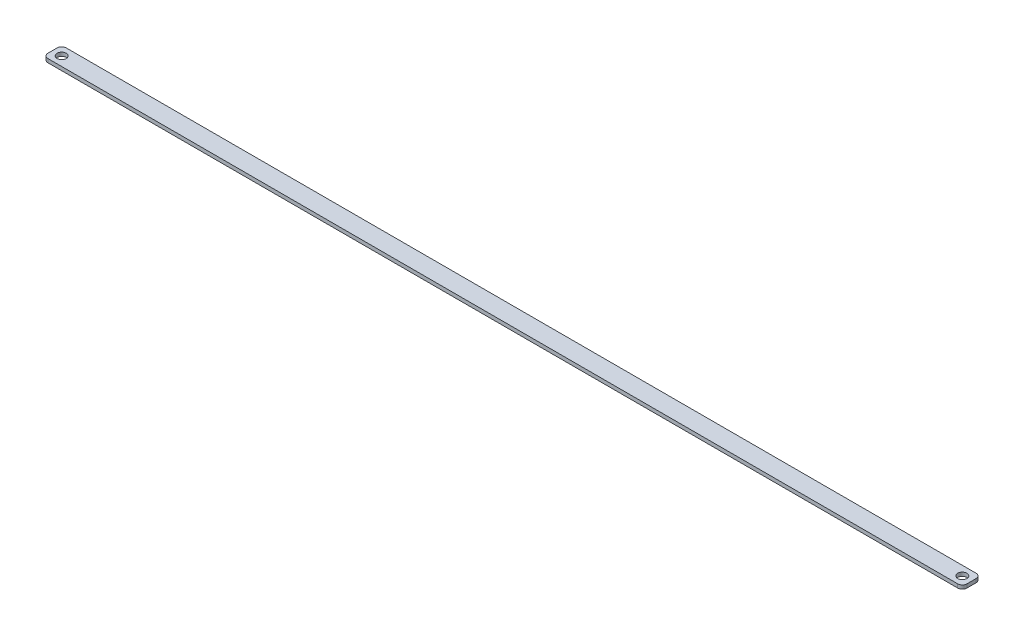
ISO-10303-21;
HEADER;
FILE_DESCRIPTION(('STEP AP214'),'2;1');
FILE_NAME('part.step','',(''),(''),'','','');
FILE_SCHEMA(('AUTOMOTIVE_DESIGN { 1 0 10303 214 1 1 1 1 }'));
ENDSEC;
DATA;
#1=APPLICATION_CONTEXT('core data for automotive mechanical design processes');
#2=APPLICATION_PROTOCOL_DEFINITION('international standard','automotive_design',2000,#1);
#3=PRODUCT_CONTEXT('',#1,'mechanical');
#4=PRODUCT('Part','Part','',(#3));
#5=PRODUCT_RELATED_PRODUCT_CATEGORY('part','',(#4));
#6=PRODUCT_DEFINITION_FORMATION('','',#4);
#7=PRODUCT_DEFINITION_CONTEXT('part definition',#1,'design');
#8=PRODUCT_DEFINITION('design','',#6,#7);
#9=PRODUCT_DEFINITION_SHAPE('','',#8);
#10=(LENGTH_UNIT() NAMED_UNIT(*) SI_UNIT(.MILLI.,.METRE.));
#11=(NAMED_UNIT(*) PLANE_ANGLE_UNIT() SI_UNIT($,.RADIAN.));
#12=(NAMED_UNIT(*) SI_UNIT($,.STERADIAN.) SOLID_ANGLE_UNIT());
#13=UNCERTAINTY_MEASURE_WITH_UNIT(LENGTH_MEASURE(1.E-05),#10,'distance_accuracy_value','');
#14=(GEOMETRIC_REPRESENTATION_CONTEXT(3) GLOBAL_UNCERTAINTY_ASSIGNED_CONTEXT((#13)) GLOBAL_UNIT_ASSIGNED_CONTEXT((#10,
#11,#12)) REPRESENTATION_CONTEXT('',''));
#15=CARTESIAN_POINT('',(0.,0.,0.));
#16=DIRECTION('',(0.,0.,1.));
#17=DIRECTION('',(1.,0.,0.));
#18=AXIS2_PLACEMENT_3D('',#15,#16,#17);
#19=CARTESIAN_POINT('',(275.43370200036,2.,-5.));
#20=DIRECTION('',(0.,-1.,0.));
#21=DIRECTION('',(0.,0.,-1.));
#22=AXIS2_PLACEMENT_3D('',#19,#20,#21);
#23=CYLINDRICAL_SURFACE('',#22,2.5);
#24=CARTESIAN_POINT('',(275.43370200036,0.,-5.));
#25=DIRECTION('',(0.,1.,0.));
#26=DIRECTION('',(0.,0.,1.));
#27=AXIS2_PLACEMENT_3D('',#24,#25,#26);
#28=CIRCLE('',#27,2.5);
#29=CARTESIAN_POINT('',(275.43370200036,0.,-2.5));
#30=VERTEX_POINT('',#29);
#31=EDGE_CURVE('E220',#30,#30,#28,.T.);
#32=ORIENTED_EDGE('',*,*,#31,.F.);
#33=EDGE_LOOP('',(#32));
#34=FACE_BOUND('',#33,.T.);
#35=CARTESIAN_POINT('',(275.43370200036,2.,-5.));
#36=DIRECTION('',(0.,1.,0.));
#37=DIRECTION('',(0.,0.,1.));
#38=AXIS2_PLACEMENT_3D('',#35,#36,#37);
#39=CIRCLE('',#38,2.5);
#40=CARTESIAN_POINT('',(275.43370200036,2.,-2.5));
#41=VERTEX_POINT('',#40);
#42=EDGE_CURVE('E13',#41,#41,#39,.T.);
#43=ORIENTED_EDGE('',*,*,#42,.T.);
#44=EDGE_LOOP('',(#43));
#45=FACE_BOUND('',#44,.T.);
#46=ADVANCED_FACE('F93',(#34,#45),#23,.F.);
#47=CARTESIAN_POINT('',(-214.56629799964,2.,-5.));
#48=DIRECTION('',(0.,-1.,0.));
#49=DIRECTION('',(0.,0.,-1.));
#50=AXIS2_PLACEMENT_3D('',#47,#48,#49);
#51=CYLINDRICAL_SURFACE('',#50,2.5);
#52=CARTESIAN_POINT('',(-214.56629799964,0.,-5.));
#53=DIRECTION('',(0.,1.,0.));
#54=DIRECTION('',(0.,0.,1.));
#55=AXIS2_PLACEMENT_3D('',#52,#53,#54);
#56=CIRCLE('',#55,2.5);
#57=CARTESIAN_POINT('',(-214.56629799964,0.,-2.5));
#58=VERTEX_POINT('',#57);
#59=EDGE_CURVE('E233',#58,#58,#56,.T.);
#60=ORIENTED_EDGE('',*,*,#59,.F.);
#61=EDGE_LOOP('',(#60));
#62=FACE_BOUND('',#61,.T.);
#63=CARTESIAN_POINT('',(-214.56629799964,2.,-5.));
#64=DIRECTION('',(0.,1.,0.));
#65=DIRECTION('',(0.,0.,1.));
#66=AXIS2_PLACEMENT_3D('',#63,#64,#65);
#67=CIRCLE('',#66,2.5);
#68=CARTESIAN_POINT('',(-214.56629799964,2.,-2.5));
#69=VERTEX_POINT('',#68);
#70=EDGE_CURVE('E103',#69,#69,#67,.T.);
#71=ORIENTED_EDGE('',*,*,#70,.T.);
#72=EDGE_LOOP('',(#71));
#73=FACE_BOUND('',#72,.T.);
#74=ADVANCED_FACE('F254',(#62,#73),#51,.F.);
#75=CARTESIAN_POINT('',(47.5,2.,-2.5));
#76=DIRECTION('',(0.,1.,0.));
#77=DIRECTION('',(0.,0.,1.));
#78=AXIS2_PLACEMENT_3D('',#75,#76,#77);
#79=PLANE('',#78);
#80=DIRECTION('',(1.,0.,0.));
#81=VECTOR('',#80,1.);
#82=CARTESIAN_POINT('',(-217.06629799964,2.,0.));
#83=LINE('',#82,#81);
#84=CARTESIAN_POINT('',(-217.06629799964,2.,0.));
#85=VERTEX_POINT('',#84);
#86=CARTESIAN_POINT('',(277.93370200036,2.,0.));
#87=VERTEX_POINT('',#86);
#88=EDGE_CURVE('E156',#85,#87,#83,.T.);
#89=ORIENTED_EDGE('',*,*,#88,.T.);
#90=CARTESIAN_POINT('',(277.93370200036,2.,-2.5));
#91=DIRECTION('',(0.,1.,0.));
#92=DIRECTION('',(0.,0.,1.));
#93=AXIS2_PLACEMENT_3D('',#90,#91,#92);
#94=CIRCLE('',#93,2.5);
#95=CARTESIAN_POINT('',(280.43370200036,2.,-2.50000000000002));
#96=VERTEX_POINT('',#95);
#97=EDGE_CURVE('E162',#87,#96,#94,.T.);
#98=ORIENTED_EDGE('',*,*,#97,.T.);
#99=DIRECTION('',(0.,0.,-1.));
#100=VECTOR('',#99,1.);
#101=CARTESIAN_POINT('',(280.43370200036,2.,-2.50000000000002));
#102=LINE('',#101,#100);
#103=CARTESIAN_POINT('',(280.43370200036,2.,-7.49999999999998));
#104=VERTEX_POINT('',#103);
#105=EDGE_CURVE('E184',#96,#104,#102,.T.);
#106=ORIENTED_EDGE('',*,*,#105,.T.);
#107=CARTESIAN_POINT('',(277.93370200036,2.,-7.5));
#108=DIRECTION('',(0.,1.,0.));
#109=DIRECTION('',(0.,0.,-1.));
#110=AXIS2_PLACEMENT_3D('',#107,#108,#109);
#111=CIRCLE('',#110,2.5);
#112=CARTESIAN_POINT('',(277.93370200036,2.,-10.));
#113=VERTEX_POINT('',#112);
#114=EDGE_CURVE('E188',#104,#113,#111,.T.);
#115=ORIENTED_EDGE('',*,*,#114,.T.);
#116=DIRECTION('',(-1.,0.,0.));
#117=VECTOR('',#116,1.);
#118=CARTESIAN_POINT('',(232.93370200036,2.,-10.));
#119=LINE('',#118,#117);
#120=CARTESIAN_POINT('',(-217.06629799964,2.,-10.));
#121=VERTEX_POINT('',#120);
#122=EDGE_CURVE('E242',#113,#121,#119,.T.);
#123=ORIENTED_EDGE('',*,*,#122,.T.);
#124=CARTESIAN_POINT('',(-217.06629799964,2.,-7.5));
#125=DIRECTION('',(0.,1.,0.));
#126=DIRECTION('',(0.,0.,-1.));
#127=AXIS2_PLACEMENT_3D('',#124,#125,#126);
#128=CIRCLE('',#127,2.5);
#129=CARTESIAN_POINT('',(-219.56629799964,2.,-7.49999999999998));
#130=VERTEX_POINT('',#129);
#131=EDGE_CURVE('E168',#121,#130,#128,.T.);
#132=ORIENTED_EDGE('',*,*,#131,.T.);
#133=DIRECTION('',(0.,0.,1.));
#134=VECTOR('',#133,1.);
#135=CARTESIAN_POINT('',(-219.56629799964,2.,-2.50000000000002));
#136=LINE('',#135,#134);
#137=CARTESIAN_POINT('',(-219.56629799964,2.,-2.50000000000002));
#138=VERTEX_POINT('',#137);
#139=EDGE_CURVE('E186',#130,#138,#136,.T.);
#140=ORIENTED_EDGE('',*,*,#139,.T.);
#141=CARTESIAN_POINT('',(-217.06629799964,2.,-2.5));
#142=DIRECTION('',(0.,1.,0.));
#143=DIRECTION('',(0.,0.,-1.));
#144=AXIS2_PLACEMENT_3D('',#141,#142,#143);
#145=CIRCLE('',#144,2.5);
#146=EDGE_CURVE('E165',#138,#85,#145,.T.);
#147=ORIENTED_EDGE('',*,*,#146,.T.);
#148=EDGE_LOOP('',(#89,#98,#106,#115,#123,#132,#140,#147));
#149=FACE_BOUND('',#148,.T.);
#150=ORIENTED_EDGE('',*,*,#42,.F.);
#151=EDGE_LOOP('',(#150));
#152=FACE_BOUND('',#151,.T.);
#153=ORIENTED_EDGE('',*,*,#70,.F.);
#154=EDGE_LOOP('',(#153));
#155=FACE_BOUND('',#154,.T.);
#156=ADVANCED_FACE('F158',(#149,#152,#155),#79,.T.);
#157=CARTESIAN_POINT('',(277.93370200036,0.,-2.5));
#158=DIRECTION('',(0.,1.,0.));
#159=DIRECTION('',(0.,0.,1.));
#160=AXIS2_PLACEMENT_3D('',#157,#158,#159);
#161=PLANE('',#160);
#162=ORIENTED_EDGE('',*,*,#31,.T.);
#163=EDGE_LOOP('',(#162));
#164=FACE_BOUND('',#163,.T.);
#165=CARTESIAN_POINT('',(277.93370200036,0.,-2.5));
#166=DIRECTION('',(0.,1.,0.));
#167=DIRECTION('',(0.,0.,1.));
#168=AXIS2_PLACEMENT_3D('',#165,#166,#167);
#169=CIRCLE('',#168,2.5);
#170=CARTESIAN_POINT('',(277.93370200036,0.,0.));
#171=VERTEX_POINT('',#170);
#172=CARTESIAN_POINT('',(280.43370200036,0.,-2.50000000000002));
#173=VERTEX_POINT('',#172);
#174=EDGE_CURVE('E177',#171,#173,#169,.T.);
#175=ORIENTED_EDGE('',*,*,#174,.F.);
#176=DIRECTION('',(1.,0.,0.));
#177=VECTOR('',#176,1.);
#178=CARTESIAN_POINT('',(-217.06629799964,0.,0.));
#179=LINE('',#178,#177);
#180=CARTESIAN_POINT('',(-217.06629799964,0.,0.));
#181=VERTEX_POINT('',#180);
#182=EDGE_CURVE('E173',#181,#171,#179,.T.);
#183=ORIENTED_EDGE('',*,*,#182,.F.);
#184=CARTESIAN_POINT('',(-217.06629799964,0.,-2.5));
#185=DIRECTION('',(0.,1.,0.));
#186=DIRECTION('',(0.,0.,-1.));
#187=AXIS2_PLACEMENT_3D('',#184,#185,#186);
#188=CIRCLE('',#187,2.5);
#189=CARTESIAN_POINT('',(-219.56629799964,0.,-2.50000000000002));
#190=VERTEX_POINT('',#189);
#191=EDGE_CURVE('E199',#190,#181,#188,.T.);
#192=ORIENTED_EDGE('',*,*,#191,.F.);
#193=DIRECTION('',(0.,0.,1.));
#194=VECTOR('',#193,1.);
#195=CARTESIAN_POINT('',(-219.56629799964,0.,-2.50000000000002));
#196=LINE('',#195,#194);
#197=CARTESIAN_POINT('',(-219.56629799964,0.,-7.49999999999998));
#198=VERTEX_POINT('',#197);
#199=EDGE_CURVE('E206',#198,#190,#196,.T.);
#200=ORIENTED_EDGE('',*,*,#199,.F.);
#201=CARTESIAN_POINT('',(-217.06629799964,0.,-7.5));
#202=DIRECTION('',(0.,1.,0.));
#203=DIRECTION('',(0.,0.,-1.));
#204=AXIS2_PLACEMENT_3D('',#201,#202,#203);
#205=CIRCLE('',#204,2.5);
#206=CARTESIAN_POINT('',(-217.06629799964,0.,-10.));
#207=VERTEX_POINT('',#206);
#208=EDGE_CURVE('E212',#207,#198,#205,.T.);
#209=ORIENTED_EDGE('',*,*,#208,.F.);
#210=DIRECTION('',(-1.,0.,0.));
#211=VECTOR('',#210,1.);
#212=CARTESIAN_POINT('',(232.93370200036,0.,-10.));
#213=LINE('',#212,#211);
#214=CARTESIAN_POINT('',(277.93370200036,0.,-10.));
#215=VERTEX_POINT('',#214);
#216=EDGE_CURVE('E218',#215,#207,#213,.T.);
#217=ORIENTED_EDGE('',*,*,#216,.F.);
#218=CARTESIAN_POINT('',(277.93370200036,0.,-7.5));
#219=DIRECTION('',(0.,1.,0.));
#220=DIRECTION('',(0.,0.,-1.));
#221=AXIS2_PLACEMENT_3D('',#218,#219,#220);
#222=CIRCLE('',#221,2.5);
#223=CARTESIAN_POINT('',(280.43370200036,0.,-7.49999999999998));
#224=VERTEX_POINT('',#223);
#225=EDGE_CURVE('E223',#224,#215,#222,.T.);
#226=ORIENTED_EDGE('',*,*,#225,.F.);
#227=DIRECTION('',(0.,0.,-1.));
#228=VECTOR('',#227,1.);
#229=CARTESIAN_POINT('',(280.43370200036,0.,-2.50000000000002));
#230=LINE('',#229,#228);
#231=EDGE_CURVE('E178',#173,#224,#230,.T.);
#232=ORIENTED_EDGE('',*,*,#231,.F.);
#233=EDGE_LOOP('',(#175,#183,#192,#200,#209,#217,#226,#232));
#234=FACE_BOUND('',#233,.T.);
#235=ORIENTED_EDGE('',*,*,#59,.T.);
#236=EDGE_LOOP('',(#235));
#237=FACE_BOUND('',#236,.T.);
#238=ADVANCED_FACE('F249',(#164,#234,#237),#161,.F.);
#239=CARTESIAN_POINT('',(232.93370200036,2.,-10.));
#240=DIRECTION('',(0.,0.,1.));
#241=DIRECTION('',(1.,0.,0.));
#242=AXIS2_PLACEMENT_3D('',#239,#240,#241);
#243=PLANE('',#242);
#244=ORIENTED_EDGE('',*,*,#216,.T.);
#245=DIRECTION('',(0.,-1.,0.));
#246=VECTOR('',#245,1.);
#247=CARTESIAN_POINT('',(-217.06629799964,2.,-10.));
#248=LINE('',#247,#246);
#249=EDGE_CURVE('E209',#121,#207,#248,.T.);
#250=ORIENTED_EDGE('',*,*,#249,.F.);
#251=ORIENTED_EDGE('',*,*,#122,.F.);
#252=DIRECTION('',(0.,-1.,0.));
#253=VECTOR('',#252,1.);
#254=CARTESIAN_POINT('',(277.93370200036,2.,-10.));
#255=LINE('',#254,#253);
#256=EDGE_CURVE('E112',#113,#215,#255,.T.);
#257=ORIENTED_EDGE('',*,*,#256,.T.);
#258=EDGE_LOOP('',(#244,#250,#251,#257));
#259=FACE_BOUND('',#258,.T.);
#260=ADVANCED_FACE('F271',(#259),#243,.F.);
#261=CARTESIAN_POINT('',(232.93370200036,2.,0.));
#262=DIRECTION('',(0.,0.,-1.));
#263=DIRECTION('',(-1.,0.,0.));
#264=AXIS2_PLACEMENT_3D('',#261,#262,#263);
#265=PLANE('',#264);
#266=DIRECTION('',(0.,-1.,0.));
#267=VECTOR('',#266,1.);
#268=CARTESIAN_POINT('',(277.93370200036,2.,0.));
#269=LINE('',#268,#267);
#270=EDGE_CURVE('E171',#87,#171,#269,.T.);
#271=ORIENTED_EDGE('',*,*,#270,.F.);
#272=ORIENTED_EDGE('',*,*,#88,.F.);
#273=DIRECTION('',(0.,-1.,0.));
#274=VECTOR('',#273,1.);
#275=CARTESIAN_POINT('',(-217.06629799964,2.,0.));
#276=LINE('',#275,#274);
#277=EDGE_CURVE('E196',#85,#181,#276,.T.);
#278=ORIENTED_EDGE('',*,*,#277,.T.);
#279=ORIENTED_EDGE('',*,*,#182,.T.);
#280=EDGE_LOOP('',(#271,#272,#278,#279));
#281=FACE_BOUND('',#280,.T.);
#282=ADVANCED_FACE('F172',(#281),#265,.F.);
#283=CARTESIAN_POINT('',(277.93370200036,2.,-2.5));
#284=DIRECTION('',(0.,-1.,0.));
#285=DIRECTION('',(0.,0.,-1.));
#286=AXIS2_PLACEMENT_3D('',#283,#284,#285);
#287=CYLINDRICAL_SURFACE('',#286,2.5);
#288=ORIENTED_EDGE('',*,*,#174,.T.);
#289=DIRECTION('',(0.,-1.,0.));
#290=VECTOR('',#289,1.);
#291=CARTESIAN_POINT('',(280.43370200036,2.,-2.50000000000002));
#292=LINE('',#291,#290);
#293=EDGE_CURVE('E182',#96,#173,#292,.T.);
#294=ORIENTED_EDGE('',*,*,#293,.F.);
#295=ORIENTED_EDGE('',*,*,#97,.F.);
#296=ORIENTED_EDGE('',*,*,#270,.T.);
#297=EDGE_LOOP('',(#288,#294,#295,#296));
#298=FACE_BOUND('',#297,.T.);
#299=ADVANCED_FACE('F180',(#298),#287,.T.);
#300=CARTESIAN_POINT('',(280.43370200036,2.,-2.50000000000002));
#301=DIRECTION('',(-1.,0.,0.));
#302=DIRECTION('',(0.,0.,1.));
#303=AXIS2_PLACEMENT_3D('',#300,#301,#302);
#304=PLANE('',#303);
#305=ORIENTED_EDGE('',*,*,#231,.T.);
#306=DIRECTION('',(0.,-1.,0.));
#307=VECTOR('',#306,1.);
#308=CARTESIAN_POINT('',(280.43370200036,2.,-7.49999999999998));
#309=LINE('',#308,#307);
#310=EDGE_CURVE('E215',#104,#224,#309,.T.);
#311=ORIENTED_EDGE('',*,*,#310,.F.);
#312=ORIENTED_EDGE('',*,*,#105,.F.);
#313=ORIENTED_EDGE('',*,*,#293,.T.);
#314=EDGE_LOOP('',(#305,#311,#312,#313));
#315=FACE_BOUND('',#314,.T.);
#316=ADVANCED_FACE('F278',(#315),#304,.F.);
#317=CARTESIAN_POINT('',(277.93370200036,2.,-7.5));
#318=DIRECTION('',(0.,-1.,0.));
#319=DIRECTION('',(0.,0.,-1.));
#320=AXIS2_PLACEMENT_3D('',#317,#318,#319);
#321=CYLINDRICAL_SURFACE('',#320,2.5);
#322=ORIENTED_EDGE('',*,*,#225,.T.);
#323=ORIENTED_EDGE('',*,*,#256,.F.);
#324=ORIENTED_EDGE('',*,*,#114,.F.);
#325=ORIENTED_EDGE('',*,*,#310,.T.);
#326=EDGE_LOOP('',(#322,#323,#324,#325));
#327=FACE_BOUND('',#326,.T.);
#328=ADVANCED_FACE('F281',(#327),#321,.T.);
#329=CARTESIAN_POINT('',(-217.06629799964,2.,-7.5));
#330=DIRECTION('',(0.,-1.,0.));
#331=DIRECTION('',(0.,0.,-1.));
#332=AXIS2_PLACEMENT_3D('',#329,#330,#331);
#333=CYLINDRICAL_SURFACE('',#332,2.5);
#334=ORIENTED_EDGE('',*,*,#208,.T.);
#335=DIRECTION('',(0.,-1.,0.));
#336=VECTOR('',#335,1.);
#337=CARTESIAN_POINT('',(-219.56629799964,2.,-7.49999999999998));
#338=LINE('',#337,#336);
#339=EDGE_CURVE('E202',#130,#198,#338,.T.);
#340=ORIENTED_EDGE('',*,*,#339,.F.);
#341=ORIENTED_EDGE('',*,*,#131,.F.);
#342=ORIENTED_EDGE('',*,*,#249,.T.);
#343=EDGE_LOOP('',(#334,#340,#341,#342));
#344=FACE_BOUND('',#343,.T.);
#345=ADVANCED_FACE('F285',(#344),#333,.T.);
#346=CARTESIAN_POINT('',(-219.56629799964,2.,-2.50000000000002));
#347=DIRECTION('',(1.,0.,0.));
#348=DIRECTION('',(0.,0.,-1.));
#349=AXIS2_PLACEMENT_3D('',#346,#347,#348);
#350=PLANE('',#349);
#351=ORIENTED_EDGE('',*,*,#199,.T.);
#352=DIRECTION('',(0.,-1.,0.));
#353=VECTOR('',#352,1.);
#354=CARTESIAN_POINT('',(-219.56629799964,2.,-2.50000000000002));
#355=LINE('',#354,#353);
#356=EDGE_CURVE('E203',#138,#190,#355,.T.);
#357=ORIENTED_EDGE('',*,*,#356,.F.);
#358=ORIENTED_EDGE('',*,*,#139,.F.);
#359=ORIENTED_EDGE('',*,*,#339,.T.);
#360=EDGE_LOOP('',(#351,#357,#358,#359));
#361=FACE_BOUND('',#360,.T.);
#362=ADVANCED_FACE('F288',(#361),#350,.F.);
#363=CARTESIAN_POINT('',(-217.06629799964,2.,-2.5));
#364=DIRECTION('',(0.,-1.,0.));
#365=DIRECTION('',(0.,0.,-1.));
#366=AXIS2_PLACEMENT_3D('',#363,#364,#365);
#367=CYLINDRICAL_SURFACE('',#366,2.5);
#368=ORIENTED_EDGE('',*,*,#191,.T.);
#369=ORIENTED_EDGE('',*,*,#277,.F.);
#370=ORIENTED_EDGE('',*,*,#146,.F.);
#371=ORIENTED_EDGE('',*,*,#356,.T.);
#372=EDGE_LOOP('',(#368,#369,#370,#371));
#373=FACE_BOUND('',#372,.T.);
#374=ADVANCED_FACE('F95',(#373),#367,.T.);
#375=CLOSED_SHELL('',(#46,#74,#156,#238,#260,#282,#299,#316,#328,#345,#362,#374));
#376=MANIFOLD_SOLID_BREP('B2',#375);
#377=ADVANCED_BREP_SHAPE_REPRESENTATION('',(#18,#376),#14);
#378=SHAPE_DEFINITION_REPRESENTATION(#9,#377);
ENDSEC;
END-ISO-10303-21;
